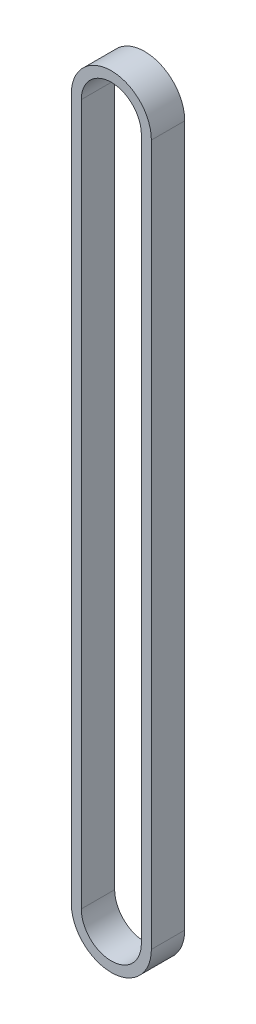
ISO-10303-21;
HEADER;
FILE_DESCRIPTION(('STEP AP214'),'2;1');
FILE_NAME('part.step','',(''),(''),'','','');
FILE_SCHEMA(('AUTOMOTIVE_DESIGN { 1 0 10303 214 1 1 1 1 }'));
ENDSEC;
DATA;
#1=APPLICATION_CONTEXT('core data for automotive mechanical design processes');
#2=APPLICATION_PROTOCOL_DEFINITION('international standard','automotive_design',2000,#1);
#3=PRODUCT_CONTEXT('',#1,'mechanical');
#4=PRODUCT('Part','Part','',(#3));
#5=PRODUCT_RELATED_PRODUCT_CATEGORY('part','',(#4));
#6=PRODUCT_DEFINITION_FORMATION('','',#4);
#7=PRODUCT_DEFINITION_CONTEXT('part definition',#1,'design');
#8=PRODUCT_DEFINITION('design','',#6,#7);
#9=PRODUCT_DEFINITION_SHAPE('','',#8);
#10=(LENGTH_UNIT() NAMED_UNIT(*) SI_UNIT(.MILLI.,.METRE.));
#11=(NAMED_UNIT(*) PLANE_ANGLE_UNIT() SI_UNIT($,.RADIAN.));
#12=(NAMED_UNIT(*) SI_UNIT($,.STERADIAN.) SOLID_ANGLE_UNIT());
#13=UNCERTAINTY_MEASURE_WITH_UNIT(LENGTH_MEASURE(1.E-05),#10,'distance_accuracy_value','');
#14=(GEOMETRIC_REPRESENTATION_CONTEXT(3) GLOBAL_UNCERTAINTY_ASSIGNED_CONTEXT((#13)) GLOBAL_UNIT_ASSIGNED_CONTEXT((#10,
#11,#12)) REPRESENTATION_CONTEXT('',''));
#15=CARTESIAN_POINT('',(0.,0.,0.));
#16=DIRECTION('',(0.,0.,1.));
#17=DIRECTION('',(1.,0.,0.));
#18=AXIS2_PLACEMENT_3D('',#15,#16,#17);
#19=CARTESIAN_POINT('',(0.,0.,10.));
#20=DIRECTION('',(0.,0.,1.));
#21=DIRECTION('',(1.,0.,0.));
#22=AXIS2_PLACEMENT_3D('',#19,#20,#21);
#23=PLANE('',#22);
#24=CARTESIAN_POINT('',(0.,0.,10.));
#25=DIRECTION('',(0.,0.,1.));
#26=DIRECTION('',(1.,0.,0.));
#27=AXIS2_PLACEMENT_3D('',#24,#25,#26);
#28=CIRCLE('',#27,12.);
#29=CARTESIAN_POINT('',(12.,0.,10.));
#30=VERTEX_POINT('',#29);
#31=CARTESIAN_POINT('',(-12.,0.,10.));
#32=VERTEX_POINT('',#31);
#33=EDGE_CURVE('E139',#30,#32,#28,.T.);
#34=ORIENTED_EDGE('',*,*,#33,.T.);
#35=DIRECTION('',(0.,-1.,0.));
#36=VECTOR('',#35,1.);
#37=CARTESIAN_POINT('',(-12.,0.,10.));
#38=LINE('',#37,#36);
#39=CARTESIAN_POINT('',(-12.,-210.,10.));
#40=VERTEX_POINT('',#39);
#41=EDGE_CURVE('E141',#32,#40,#38,.T.);
#42=ORIENTED_EDGE('',*,*,#41,.T.);
#43=CARTESIAN_POINT('',(0.,-210.,10.));
#44=DIRECTION('',(0.,0.,1.));
#45=DIRECTION('',(1.,0.,0.));
#46=AXIS2_PLACEMENT_3D('',#43,#44,#45);
#47=CIRCLE('',#46,12.);
#48=CARTESIAN_POINT('',(12.,-210.,10.));
#49=VERTEX_POINT('',#48);
#50=EDGE_CURVE('E146',#40,#49,#47,.T.);
#51=ORIENTED_EDGE('',*,*,#50,.T.);
#52=DIRECTION('',(0.,1.,0.));
#53=VECTOR('',#52,1.);
#54=CARTESIAN_POINT('',(12.,0.,10.));
#55=LINE('',#54,#53);
#56=EDGE_CURVE('E147',#49,#30,#55,.T.);
#57=ORIENTED_EDGE('',*,*,#56,.T.);
#58=EDGE_LOOP('',(#34,#42,#51,#57));
#59=FACE_BOUND('',#58,.T.);
#60=DIRECTION('',(0.,-1.,0.));
#61=VECTOR('',#60,1.);
#62=CARTESIAN_POINT('',(-9.,0.,10.));
#63=LINE('',#62,#61);
#64=CARTESIAN_POINT('',(-9.,0.,10.));
#65=VERTEX_POINT('',#64);
#66=CARTESIAN_POINT('',(-8.99999999999997,-210.,10.));
#67=VERTEX_POINT('',#66);
#68=EDGE_CURVE('E115',#65,#67,#63,.T.);
#69=ORIENTED_EDGE('',*,*,#68,.F.);
#70=CARTESIAN_POINT('',(0.,0.,10.));
#71=DIRECTION('',(0.,0.,1.));
#72=DIRECTION('',(1.,0.,0.));
#73=AXIS2_PLACEMENT_3D('',#70,#71,#72);
#74=CIRCLE('',#73,9.);
#75=CARTESIAN_POINT('',(9.,0.,10.));
#76=VERTEX_POINT('',#75);
#77=EDGE_CURVE('E104',#76,#65,#74,.T.);
#78=ORIENTED_EDGE('',*,*,#77,.F.);
#79=DIRECTION('',(0.,1.,0.));
#80=VECTOR('',#79,1.);
#81=CARTESIAN_POINT('',(9.,0.,10.));
#82=LINE('',#81,#80);
#83=CARTESIAN_POINT('',(9.00000000000002,-210.,10.));
#84=VERTEX_POINT('',#83);
#85=EDGE_CURVE('E126',#84,#76,#82,.T.);
#86=ORIENTED_EDGE('',*,*,#85,.F.);
#87=CARTESIAN_POINT('',(0.,-210.,10.));
#88=DIRECTION('',(0.,0.,1.));
#89=DIRECTION('',(1.,0.,0.));
#90=AXIS2_PLACEMENT_3D('',#87,#88,#89);
#91=CIRCLE('',#90,9.);
#92=EDGE_CURVE('E121',#67,#84,#91,.T.);
#93=ORIENTED_EDGE('',*,*,#92,.F.);
#94=EDGE_LOOP('',(#69,#78,#86,#93));
#95=FACE_BOUND('',#94,.T.);
#96=ADVANCED_FACE('F39',(#59,#95),#23,.T.);
#97=CARTESIAN_POINT('',(0.,0.,0.));
#98=DIRECTION('',(0.,0.,1.));
#99=DIRECTION('',(1.,0.,0.));
#100=AXIS2_PLACEMENT_3D('',#97,#98,#99);
#101=PLANE('',#100);
#102=CARTESIAN_POINT('',(0.,0.,0.));
#103=DIRECTION('',(0.,0.,1.));
#104=DIRECTION('',(1.,0.,0.));
#105=AXIS2_PLACEMENT_3D('',#102,#103,#104);
#106=CIRCLE('',#105,12.);
#107=CARTESIAN_POINT('',(12.,0.,0.));
#108=VERTEX_POINT('',#107);
#109=CARTESIAN_POINT('',(-12.,0.,0.));
#110=VERTEX_POINT('',#109);
#111=EDGE_CURVE('E119',#108,#110,#106,.T.);
#112=ORIENTED_EDGE('',*,*,#111,.F.);
#113=DIRECTION('',(0.,1.,0.));
#114=VECTOR('',#113,1.);
#115=CARTESIAN_POINT('',(12.,0.,0.));
#116=LINE('',#115,#114);
#117=CARTESIAN_POINT('',(12.,-210.,0.));
#118=VERTEX_POINT('',#117);
#119=EDGE_CURVE('E144',#118,#108,#116,.T.);
#120=ORIENTED_EDGE('',*,*,#119,.F.);
#121=CARTESIAN_POINT('',(0.,-210.,0.));
#122=DIRECTION('',(0.,0.,1.));
#123=DIRECTION('',(1.,0.,0.));
#124=AXIS2_PLACEMENT_3D('',#121,#122,#123);
#125=CIRCLE('',#124,12.);
#126=CARTESIAN_POINT('',(-12.,-210.,0.));
#127=VERTEX_POINT('',#126);
#128=EDGE_CURVE('E152',#127,#118,#125,.T.);
#129=ORIENTED_EDGE('',*,*,#128,.F.);
#130=DIRECTION('',(0.,-1.,0.));
#131=VECTOR('',#130,1.);
#132=CARTESIAN_POINT('',(-12.,0.,0.));
#133=LINE('',#132,#131);
#134=EDGE_CURVE('E155',#110,#127,#133,.T.);
#135=ORIENTED_EDGE('',*,*,#134,.F.);
#136=EDGE_LOOP('',(#112,#120,#129,#135));
#137=FACE_BOUND('',#136,.T.);
#138=CARTESIAN_POINT('',(0.,0.,0.));
#139=DIRECTION('',(0.,0.,1.));
#140=DIRECTION('',(1.,0.,0.));
#141=AXIS2_PLACEMENT_3D('',#138,#139,#140);
#142=CIRCLE('',#141,9.);
#143=CARTESIAN_POINT('',(9.,0.,0.));
#144=VERTEX_POINT('',#143);
#145=CARTESIAN_POINT('',(-9.,0.,0.));
#146=VERTEX_POINT('',#145);
#147=EDGE_CURVE('E65',#144,#146,#142,.T.);
#148=ORIENTED_EDGE('',*,*,#147,.T.);
#149=DIRECTION('',(0.,-1.,0.));
#150=VECTOR('',#149,1.);
#151=CARTESIAN_POINT('',(-9.,0.,0.));
#152=LINE('',#151,#150);
#153=CARTESIAN_POINT('',(-8.99999999999997,-210.,0.));
#154=VERTEX_POINT('',#153);
#155=EDGE_CURVE('E118',#146,#154,#152,.T.);
#156=ORIENTED_EDGE('',*,*,#155,.T.);
#157=CARTESIAN_POINT('',(0.,-210.,0.));
#158=DIRECTION('',(0.,0.,1.));
#159=DIRECTION('',(1.,0.,0.));
#160=AXIS2_PLACEMENT_3D('',#157,#158,#159);
#161=CIRCLE('',#160,9.);
#162=CARTESIAN_POINT('',(9.00000000000002,-210.,0.));
#163=VERTEX_POINT('',#162);
#164=EDGE_CURVE('E131',#154,#163,#161,.T.);
#165=ORIENTED_EDGE('',*,*,#164,.T.);
#166=DIRECTION('',(0.,1.,0.));
#167=VECTOR('',#166,1.);
#168=CARTESIAN_POINT('',(9.,0.,0.));
#169=LINE('',#168,#167);
#170=EDGE_CURVE('E113',#163,#144,#169,.T.);
#171=ORIENTED_EDGE('',*,*,#170,.T.);
#172=EDGE_LOOP('',(#148,#156,#165,#171));
#173=FACE_BOUND('',#172,.T.);
#174=ADVANCED_FACE('F173',(#137,#173),#101,.F.);
#175=CARTESIAN_POINT('',(0.,0.,10.));
#176=DIRECTION('',(0.,0.,-1.));
#177=DIRECTION('',(-1.,0.,0.));
#178=AXIS2_PLACEMENT_3D('',#175,#176,#177);
#179=CYLINDRICAL_SURFACE('',#178,12.);
#180=ORIENTED_EDGE('',*,*,#111,.T.);
#181=DIRECTION('',(0.,0.,-1.));
#182=VECTOR('',#181,1.);
#183=CARTESIAN_POINT('',(-12.,0.,10.));
#184=LINE('',#183,#182);
#185=EDGE_CURVE('E11',#32,#110,#184,.T.);
#186=ORIENTED_EDGE('',*,*,#185,.F.);
#187=ORIENTED_EDGE('',*,*,#33,.F.);
#188=DIRECTION('',(0.,0.,-1.));
#189=VECTOR('',#188,1.);
#190=CARTESIAN_POINT('',(12.,0.,10.));
#191=LINE('',#190,#189);
#192=EDGE_CURVE('E149',#30,#108,#191,.T.);
#193=ORIENTED_EDGE('',*,*,#192,.T.);
#194=EDGE_LOOP('',(#180,#186,#187,#193));
#195=FACE_BOUND('',#194,.T.);
#196=ADVANCED_FACE('F41',(#195),#179,.T.);
#197=CARTESIAN_POINT('',(-12.,0.,10.));
#198=DIRECTION('',(1.,0.,0.));
#199=DIRECTION('',(0.,1.,0.));
#200=AXIS2_PLACEMENT_3D('',#197,#198,#199);
#201=PLANE('',#200);
#202=ORIENTED_EDGE('',*,*,#134,.T.);
#203=DIRECTION('',(0.,0.,-1.));
#204=VECTOR('',#203,1.);
#205=CARTESIAN_POINT('',(-12.,-210.,10.));
#206=LINE('',#205,#204);
#207=EDGE_CURVE('E50',#40,#127,#206,.T.);
#208=ORIENTED_EDGE('',*,*,#207,.F.);
#209=ORIENTED_EDGE('',*,*,#41,.F.);
#210=ORIENTED_EDGE('',*,*,#185,.T.);
#211=EDGE_LOOP('',(#202,#208,#209,#210));
#212=FACE_BOUND('',#211,.T.);
#213=ADVANCED_FACE('F182',(#212),#201,.F.);
#214=CARTESIAN_POINT('',(0.,-210.,10.));
#215=DIRECTION('',(0.,0.,-1.));
#216=DIRECTION('',(-1.,0.,0.));
#217=AXIS2_PLACEMENT_3D('',#214,#215,#216);
#218=CYLINDRICAL_SURFACE('',#217,12.);
#219=ORIENTED_EDGE('',*,*,#128,.T.);
#220=DIRECTION('',(0.,0.,-1.));
#221=VECTOR('',#220,1.);
#222=CARTESIAN_POINT('',(12.,-210.,10.));
#223=LINE('',#222,#221);
#224=EDGE_CURVE('E159',#49,#118,#223,.T.);
#225=ORIENTED_EDGE('',*,*,#224,.F.);
#226=ORIENTED_EDGE('',*,*,#50,.F.);
#227=ORIENTED_EDGE('',*,*,#207,.T.);
#228=EDGE_LOOP('',(#219,#225,#226,#227));
#229=FACE_BOUND('',#228,.T.);
#230=ADVANCED_FACE('F170',(#229),#218,.T.);
#231=CARTESIAN_POINT('',(12.,0.,10.));
#232=DIRECTION('',(-1.,0.,0.));
#233=DIRECTION('',(0.,-1.,0.));
#234=AXIS2_PLACEMENT_3D('',#231,#232,#233);
#235=PLANE('',#234);
#236=ORIENTED_EDGE('',*,*,#119,.T.);
#237=ORIENTED_EDGE('',*,*,#192,.F.);
#238=ORIENTED_EDGE('',*,*,#56,.F.);
#239=ORIENTED_EDGE('',*,*,#224,.T.);
#240=EDGE_LOOP('',(#236,#237,#238,#239));
#241=FACE_BOUND('',#240,.T.);
#242=ADVANCED_FACE('F180',(#241),#235,.F.);
#243=CARTESIAN_POINT('',(0.,0.,10.));
#244=DIRECTION('',(0.,0.,-1.));
#245=DIRECTION('',(-1.,0.,0.));
#246=AXIS2_PLACEMENT_3D('',#243,#244,#245);
#247=CYLINDRICAL_SURFACE('',#246,9.);
#248=ORIENTED_EDGE('',*,*,#147,.F.);
#249=DIRECTION('',(0.,0.,-1.));
#250=VECTOR('',#249,1.);
#251=CARTESIAN_POINT('',(9.,0.,10.));
#252=LINE('',#251,#250);
#253=EDGE_CURVE('E108',#76,#144,#252,.T.);
#254=ORIENTED_EDGE('',*,*,#253,.F.);
#255=ORIENTED_EDGE('',*,*,#77,.T.);
#256=DIRECTION('',(0.,0.,-1.));
#257=VECTOR('',#256,1.);
#258=CARTESIAN_POINT('',(-9.,0.,10.));
#259=LINE('',#258,#257);
#260=EDGE_CURVE('E110',#65,#146,#259,.T.);
#261=ORIENTED_EDGE('',*,*,#260,.T.);
#262=EDGE_LOOP('',(#248,#254,#255,#261));
#263=FACE_BOUND('',#262,.T.);
#264=ADVANCED_FACE('F106',(#263),#247,.F.);
#265=CARTESIAN_POINT('',(-9.,0.,10.));
#266=DIRECTION('',(1.,0.,0.));
#267=DIRECTION('',(0.,1.,0.));
#268=AXIS2_PLACEMENT_3D('',#265,#266,#267);
#269=PLANE('',#268);
#270=ORIENTED_EDGE('',*,*,#155,.F.);
#271=ORIENTED_EDGE('',*,*,#260,.F.);
#272=ORIENTED_EDGE('',*,*,#68,.T.);
#273=DIRECTION('',(0.,0.,-1.));
#274=VECTOR('',#273,1.);
#275=CARTESIAN_POINT('',(-8.99999999999997,-210.,10.));
#276=LINE('',#275,#274);
#277=EDGE_CURVE('E122',#67,#154,#276,.T.);
#278=ORIENTED_EDGE('',*,*,#277,.T.);
#279=EDGE_LOOP('',(#270,#271,#272,#278));
#280=FACE_BOUND('',#279,.T.);
#281=ADVANCED_FACE('F116',(#280),#269,.T.);
#282=CARTESIAN_POINT('',(0.,-210.,10.));
#283=DIRECTION('',(0.,0.,-1.));
#284=DIRECTION('',(-1.,0.,0.));
#285=AXIS2_PLACEMENT_3D('',#282,#283,#284);
#286=CYLINDRICAL_SURFACE('',#285,9.);
#287=ORIENTED_EDGE('',*,*,#164,.F.);
#288=ORIENTED_EDGE('',*,*,#277,.F.);
#289=ORIENTED_EDGE('',*,*,#92,.T.);
#290=DIRECTION('',(0.,0.,-1.));
#291=VECTOR('',#290,1.);
#292=CARTESIAN_POINT('',(9.00000000000002,-210.,10.));
#293=LINE('',#292,#291);
#294=EDGE_CURVE('E53',#84,#163,#293,.T.);
#295=ORIENTED_EDGE('',*,*,#294,.T.);
#296=EDGE_LOOP('',(#287,#288,#289,#295));
#297=FACE_BOUND('',#296,.T.);
#298=ADVANCED_FACE('F207',(#297),#286,.F.);
#299=CARTESIAN_POINT('',(9.,0.,10.));
#300=DIRECTION('',(-1.,0.,0.));
#301=DIRECTION('',(0.,-1.,0.));
#302=AXIS2_PLACEMENT_3D('',#299,#300,#301);
#303=PLANE('',#302);
#304=ORIENTED_EDGE('',*,*,#170,.F.);
#305=ORIENTED_EDGE('',*,*,#294,.F.);
#306=ORIENTED_EDGE('',*,*,#85,.T.);
#307=ORIENTED_EDGE('',*,*,#253,.T.);
#308=EDGE_LOOP('',(#304,#305,#306,#307));
#309=FACE_BOUND('',#308,.T.);
#310=ADVANCED_FACE('F208',(#309),#303,.T.);
#311=CLOSED_SHELL('',(#96,#174,#196,#213,#230,#242,#264,#281,#298,#310));
#312=MANIFOLD_SOLID_BREP('B2',#311);
#313=ADVANCED_BREP_SHAPE_REPRESENTATION('',(#18,#312),#14);
#314=SHAPE_DEFINITION_REPRESENTATION(#9,#313);
ENDSEC;
END-ISO-10303-21;
